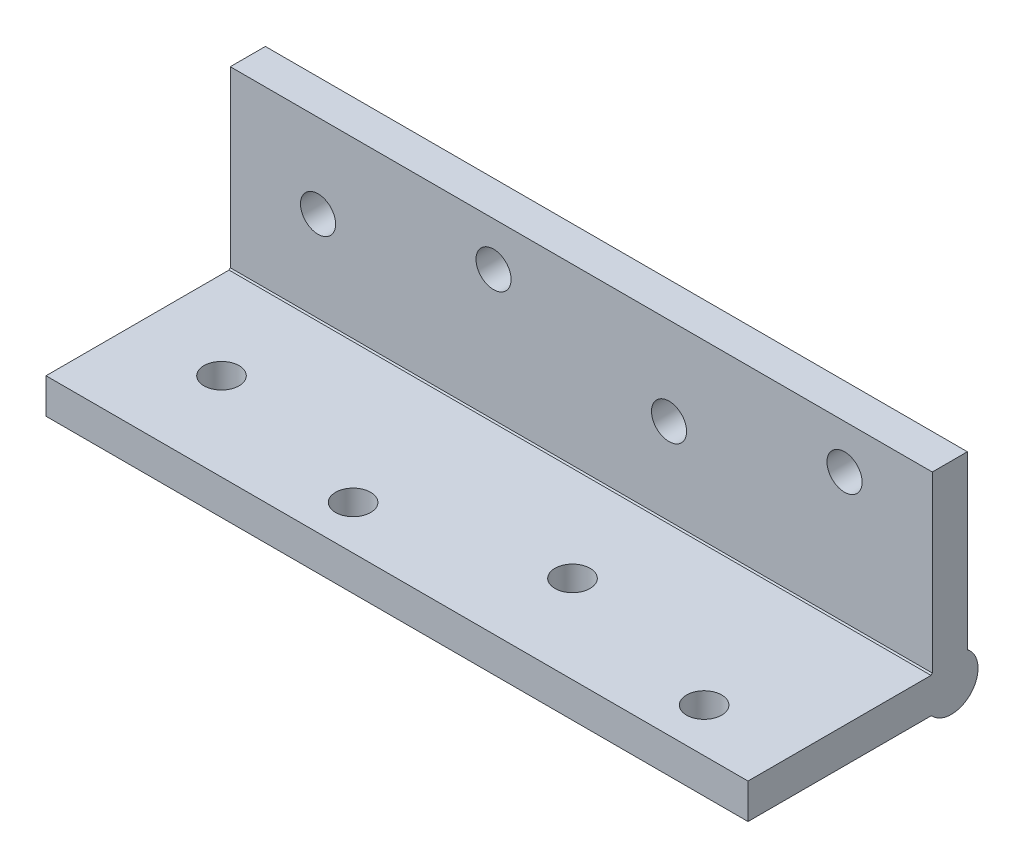
ISO-10303-21;
HEADER;
FILE_DESCRIPTION(('STEP AP214'),'2;1');
FILE_NAME('part.step','',(''),(''),'','','');
FILE_SCHEMA(('AUTOMOTIVE_DESIGN { 1 0 10303 214 1 1 1 1 }'));
ENDSEC;
DATA;
#1=APPLICATION_CONTEXT('core data for automotive mechanical design processes');
#2=APPLICATION_PROTOCOL_DEFINITION('international standard','automotive_design',2000,#1);
#3=PRODUCT_CONTEXT('',#1,'mechanical');
#4=PRODUCT('Part','Part','',(#3));
#5=PRODUCT_RELATED_PRODUCT_CATEGORY('part','',(#4));
#6=PRODUCT_DEFINITION_FORMATION('','',#4);
#7=PRODUCT_DEFINITION_CONTEXT('part definition',#1,'design');
#8=PRODUCT_DEFINITION('design','',#6,#7);
#9=PRODUCT_DEFINITION_SHAPE('','',#8);
#10=(LENGTH_UNIT() NAMED_UNIT(*) SI_UNIT(.MILLI.,.METRE.));
#11=(NAMED_UNIT(*) PLANE_ANGLE_UNIT() SI_UNIT($,.RADIAN.));
#12=(NAMED_UNIT(*) SI_UNIT($,.STERADIAN.) SOLID_ANGLE_UNIT());
#13=UNCERTAINTY_MEASURE_WITH_UNIT(LENGTH_MEASURE(1.E-05),#10,'distance_accuracy_value','');
#14=(GEOMETRIC_REPRESENTATION_CONTEXT(3) GLOBAL_UNCERTAINTY_ASSIGNED_CONTEXT((#13)) GLOBAL_UNIT_ASSIGNED_CONTEXT((#10,
#11,#12)) REPRESENTATION_CONTEXT('',''));
#15=CARTESIAN_POINT('',(0.,0.,0.));
#16=DIRECTION('',(0.,0.,1.));
#17=DIRECTION('',(1.,0.,0.));
#18=AXIS2_PLACEMENT_3D('',#15,#16,#17);
#19=CARTESIAN_POINT('',(40.,4.,-12.5));
#20=DIRECTION('',(-1.,0.,0.));
#21=DIRECTION('',(0.,0.,1.));
#22=AXIS2_PLACEMENT_3D('',#19,#20,#21);
#23=PLANE('',#22);
#24=DIRECTION('',(0.,0.,-1.));
#25=VECTOR('',#24,1.);
#26=CARTESIAN_POINT('',(40.,0.,-12.5));
#27=LINE('',#26,#25);
#28=CARTESIAN_POINT('',(40.,0.,12.5));
#29=VERTEX_POINT('',#28);
#30=CARTESIAN_POINT('',(40.,0.,-8.40517207912375));
#31=VERTEX_POINT('',#30);
#32=EDGE_CURVE('E184',#29,#31,#27,.T.);
#33=ORIENTED_EDGE('',*,*,#32,.T.);
#34=CARTESIAN_POINT('',(40.,2.02819838325771,-10.673404756013));
#35=DIRECTION('',(-1.,0.,0.));
#36=DIRECTION('',(0.,0.,1.));
#37=AXIS2_PLACEMENT_3D('',#34,#35,#36);
#38=CIRCLE('',#37,3.04277310333144);
#39=CARTESIAN_POINT('',(40.,4.46171805094096,-12.5));
#40=VERTEX_POINT('',#39);
#41=EDGE_CURVE('E185',#40,#31,#38,.T.);
#42=ORIENTED_EDGE('',*,*,#41,.F.);
#43=DIRECTION('',(0.,-1.,0.));
#44=VECTOR('',#43,1.);
#45=CARTESIAN_POINT('',(40.,4.,-12.5));
#46=LINE('',#45,#44);
#47=CARTESIAN_POINT('',(40.,24.,-12.5));
#48=VERTEX_POINT('',#47);
#49=EDGE_CURVE('E48',#48,#40,#46,.T.);
#50=ORIENTED_EDGE('',*,*,#49,.F.);
#51=DIRECTION('',(0.,0.,-1.));
#52=VECTOR('',#51,1.);
#53=CARTESIAN_POINT('',(40.,24.,-12.5));
#54=LINE('',#53,#52);
#55=CARTESIAN_POINT('',(40.,24.,-8.5));
#56=VERTEX_POINT('',#55);
#57=EDGE_CURVE('E219',#56,#48,#54,.T.);
#58=ORIENTED_EDGE('',*,*,#57,.F.);
#59=DIRECTION('',(0.,-1.,0.));
#60=VECTOR('',#59,1.);
#61=CARTESIAN_POINT('',(40.,24.,-8.5));
#62=LINE('',#61,#60);
#63=CARTESIAN_POINT('',(40.,4.15770065489244,-8.5));
#64=VERTEX_POINT('',#63);
#65=EDGE_CURVE('E197',#56,#64,#62,.T.);
#66=ORIENTED_EDGE('',*,*,#65,.T.);
#67=CARTESIAN_POINT('',(40.,4.,-8.35597804895841));
#68=VERTEX_POINT('',#67);
#69=EDGE_CURVE('E231',#68,#64,#38,.T.);
#70=ORIENTED_EDGE('',*,*,#69,.F.);
#71=DIRECTION('',(0.,0.,-1.));
#72=VECTOR('',#71,1.);
#73=CARTESIAN_POINT('',(40.,4.,-12.5));
#74=LINE('',#73,#72);
#75=CARTESIAN_POINT('',(40.,4.,12.5));
#76=VERTEX_POINT('',#75);
#77=EDGE_CURVE('E56',#76,#68,#74,.T.);
#78=ORIENTED_EDGE('',*,*,#77,.F.);
#79=DIRECTION('',(0.,-1.,0.));
#80=VECTOR('',#79,1.);
#81=CARTESIAN_POINT('',(40.,4.,12.5));
#82=LINE('',#81,#80);
#83=EDGE_CURVE('E135',#76,#29,#82,.T.);
#84=ORIENTED_EDGE('',*,*,#83,.T.);
#85=EDGE_LOOP('',(#33,#42,#50,#58,#66,#70,#78,#84));
#86=FACE_BOUND('',#85,.T.);
#87=ADVANCED_FACE('F39',(#86),#23,.F.);
#88=CARTESIAN_POINT('',(-40.,4.,-12.5));
#89=DIRECTION('',(0.,0.,1.));
#90=DIRECTION('',(1.,0.,0.));
#91=AXIS2_PLACEMENT_3D('',#88,#89,#90);
#92=PLANE('',#91);
#93=CARTESIAN_POINT('',(-30.,14.461718050941,-12.5));
#94=DIRECTION('',(0.,0.,-1.));
#95=DIRECTION('',(-1.,0.,0.));
#96=AXIS2_PLACEMENT_3D('',#93,#94,#95);
#97=CIRCLE('',#96,2.);
#98=CARTESIAN_POINT('',(-32.,14.461718050941,-12.5));
#99=VERTEX_POINT('',#98);
#100=EDGE_CURVE('E144',#99,#99,#97,.T.);
#101=ORIENTED_EDGE('',*,*,#100,.F.);
#102=EDGE_LOOP('',(#101));
#103=FACE_BOUND('',#102,.T.);
#104=CARTESIAN_POINT('',(10.,14.,-12.5));
#105=DIRECTION('',(0.,0.,-1.));
#106=DIRECTION('',(-1.,0.,0.));
#107=AXIS2_PLACEMENT_3D('',#104,#105,#106);
#108=CIRCLE('',#107,2.);
#109=CARTESIAN_POINT('',(8.,14.,-12.5));
#110=VERTEX_POINT('',#109);
#111=EDGE_CURVE('E247',#110,#110,#108,.T.);
#112=ORIENTED_EDGE('',*,*,#111,.F.);
#113=EDGE_LOOP('',(#112));
#114=FACE_BOUND('',#113,.T.);
#115=CARTESIAN_POINT('',(-10.,19.,-12.5));
#116=DIRECTION('',(0.,0.,-1.));
#117=DIRECTION('',(-1.,0.,0.));
#118=AXIS2_PLACEMENT_3D('',#115,#116,#117);
#119=CIRCLE('',#118,2.);
#120=CARTESIAN_POINT('',(-12.,19.,-12.5));
#121=VERTEX_POINT('',#120);
#122=EDGE_CURVE('E242',#121,#121,#119,.T.);
#123=ORIENTED_EDGE('',*,*,#122,.F.);
#124=EDGE_LOOP('',(#123));
#125=FACE_BOUND('',#124,.T.);
#126=CARTESIAN_POINT('',(30.,19.,-12.5));
#127=DIRECTION('',(0.,0.,-1.));
#128=DIRECTION('',(-1.,0.,0.));
#129=AXIS2_PLACEMENT_3D('',#126,#127,#128);
#130=CIRCLE('',#129,2.);
#131=CARTESIAN_POINT('',(28.,19.,-12.5));
#132=VERTEX_POINT('',#131);
#133=EDGE_CURVE('E238',#132,#132,#130,.T.);
#134=ORIENTED_EDGE('',*,*,#133,.F.);
#135=EDGE_LOOP('',(#134));
#136=FACE_BOUND('',#135,.T.);
#137=ORIENTED_EDGE('',*,*,#49,.T.);
#138=DIRECTION('',(-1.,0.,0.));
#139=VECTOR('',#138,1.);
#140=CARTESIAN_POINT('',(40.,4.46171805094096,-12.5));
#141=LINE('',#140,#139);
#142=CARTESIAN_POINT('',(-40.,4.46171805094096,-12.5));
#143=VERTEX_POINT('',#142);
#144=EDGE_CURVE('E105',#40,#143,#141,.T.);
#145=ORIENTED_EDGE('',*,*,#144,.T.);
#146=DIRECTION('',(0.,-1.,0.));
#147=VECTOR('',#146,1.);
#148=CARTESIAN_POINT('',(-40.,4.,-12.5));
#149=LINE('',#148,#147);
#150=CARTESIAN_POINT('',(-40.,24.,-12.5));
#151=VERTEX_POINT('',#150);
#152=EDGE_CURVE('E119',#151,#143,#149,.T.);
#153=ORIENTED_EDGE('',*,*,#152,.F.);
#154=DIRECTION('',(-1.,0.,0.));
#155=VECTOR('',#154,1.);
#156=CARTESIAN_POINT('',(-40.,24.,-12.5));
#157=LINE('',#156,#155);
#158=EDGE_CURVE('E216',#48,#151,#157,.T.);
#159=ORIENTED_EDGE('',*,*,#158,.F.);
#160=EDGE_LOOP('',(#137,#145,#153,#159));
#161=FACE_BOUND('',#160,.T.);
#162=ADVANCED_FACE('F117',(#103,#114,#125,#136,#161),#92,.F.);
#163=CARTESIAN_POINT('',(-40.,4.,-12.5));
#164=DIRECTION('',(1.,0.,0.));
#165=DIRECTION('',(0.,0.,-1.));
#166=AXIS2_PLACEMENT_3D('',#163,#164,#165);
#167=PLANE('',#166);
#168=DIRECTION('',(0.,0.,1.));
#169=VECTOR('',#168,1.);
#170=CARTESIAN_POINT('',(-40.,4.,-12.5));
#171=LINE('',#170,#169);
#172=CARTESIAN_POINT('',(-40.,4.,-8.35597804895841));
#173=VERTEX_POINT('',#172);
#174=CARTESIAN_POINT('',(-40.,4.,12.5));
#175=VERTEX_POINT('',#174);
#176=EDGE_CURVE('E206',#173,#175,#171,.T.);
#177=ORIENTED_EDGE('',*,*,#176,.F.);
#178=CARTESIAN_POINT('',(-40.,2.02819838325771,-10.673404756013));
#179=DIRECTION('',(-1.,0.,0.));
#180=DIRECTION('',(0.,0.,1.));
#181=AXIS2_PLACEMENT_3D('',#178,#179,#180);
#182=CIRCLE('',#181,3.04277310333144);
#183=CARTESIAN_POINT('',(-40.,4.15770065489244,-8.5));
#184=VERTEX_POINT('',#183);
#185=EDGE_CURVE('E113',#173,#184,#182,.T.);
#186=ORIENTED_EDGE('',*,*,#185,.T.);
#187=DIRECTION('',(0.,-1.,0.));
#188=VECTOR('',#187,1.);
#189=CARTESIAN_POINT('',(-40.,24.,-8.5));
#190=LINE('',#189,#188);
#191=CARTESIAN_POINT('',(-40.,24.,-8.5));
#192=VERTEX_POINT('',#191);
#193=EDGE_CURVE('E191',#192,#184,#190,.T.);
#194=ORIENTED_EDGE('',*,*,#193,.F.);
#195=DIRECTION('',(0.,0.,1.));
#196=VECTOR('',#195,1.);
#197=CARTESIAN_POINT('',(-40.,24.,-12.5));
#198=LINE('',#197,#196);
#199=EDGE_CURVE('E122',#151,#192,#198,.T.);
#200=ORIENTED_EDGE('',*,*,#199,.F.);
#201=ORIENTED_EDGE('',*,*,#152,.T.);
#202=CARTESIAN_POINT('',(-40.,0.,-8.40517207912375));
#203=VERTEX_POINT('',#202);
#204=EDGE_CURVE('E102',#143,#203,#182,.T.);
#205=ORIENTED_EDGE('',*,*,#204,.T.);
#206=DIRECTION('',(0.,0.,1.));
#207=VECTOR('',#206,1.);
#208=CARTESIAN_POINT('',(-40.,0.,-12.5));
#209=LINE('',#208,#207);
#210=CARTESIAN_POINT('',(-40.,0.,12.5));
#211=VERTEX_POINT('',#210);
#212=EDGE_CURVE('E190',#203,#211,#209,.T.);
#213=ORIENTED_EDGE('',*,*,#212,.T.);
#214=DIRECTION('',(0.,-1.,0.));
#215=VECTOR('',#214,1.);
#216=CARTESIAN_POINT('',(-40.,4.,12.5));
#217=LINE('',#216,#215);
#218=EDGE_CURVE('E129',#175,#211,#217,.T.);
#219=ORIENTED_EDGE('',*,*,#218,.F.);
#220=EDGE_LOOP('',(#177,#186,#194,#200,#201,#205,#213,#219));
#221=FACE_BOUND('',#220,.T.);
#222=ADVANCED_FACE('F125',(#221),#167,.F.);
#223=CARTESIAN_POINT('',(-40.,4.,12.5));
#224=DIRECTION('',(0.,0.,-1.));
#225=DIRECTION('',(-1.,0.,0.));
#226=AXIS2_PLACEMENT_3D('',#223,#224,#225);
#227=PLANE('',#226);
#228=DIRECTION('',(1.,0.,0.));
#229=VECTOR('',#228,1.);
#230=CARTESIAN_POINT('',(-40.,0.,12.5));
#231=LINE('',#230,#229);
#232=EDGE_CURVE('E195',#211,#29,#231,.T.);
#233=ORIENTED_EDGE('',*,*,#232,.T.);
#234=ORIENTED_EDGE('',*,*,#83,.F.);
#235=DIRECTION('',(1.,0.,0.));
#236=VECTOR('',#235,1.);
#237=CARTESIAN_POINT('',(-40.,4.,12.5));
#238=LINE('',#237,#236);
#239=EDGE_CURVE('E200',#175,#76,#238,.T.);
#240=ORIENTED_EDGE('',*,*,#239,.F.);
#241=ORIENTED_EDGE('',*,*,#218,.T.);
#242=EDGE_LOOP('',(#233,#234,#240,#241));
#243=FACE_BOUND('',#242,.T.);
#244=ADVANCED_FACE('F298',(#243),#227,.F.);
#245=CARTESIAN_POINT('',(0.,4.,0.));
#246=DIRECTION('',(0.,1.,0.));
#247=DIRECTION('',(0.,0.,1.));
#248=AXIS2_PLACEMENT_3D('',#245,#246,#247);
#249=PLANE('',#248);
#250=CARTESIAN_POINT('',(-30.,4.,2.5));
#251=DIRECTION('',(0.,1.,0.));
#252=DIRECTION('',(0.,0.,1.));
#253=AXIS2_PLACEMENT_3D('',#250,#251,#252);
#254=CIRCLE('',#253,2.);
#255=CARTESIAN_POINT('',(-30.,4.,4.5));
#256=VERTEX_POINT('',#255);
#257=EDGE_CURVE('E243',#256,#256,#254,.T.);
#258=ORIENTED_EDGE('',*,*,#257,.F.);
#259=EDGE_LOOP('',(#258));
#260=FACE_BOUND('',#259,.T.);
#261=CARTESIAN_POINT('',(-10.,4.,7.5));
#262=DIRECTION('',(0.,1.,0.));
#263=DIRECTION('',(0.,0.,1.));
#264=AXIS2_PLACEMENT_3D('',#261,#262,#263);
#265=CIRCLE('',#264,2.);
#266=CARTESIAN_POINT('',(-10.,4.,9.5));
#267=VERTEX_POINT('',#266);
#268=EDGE_CURVE('E256',#267,#267,#265,.T.);
#269=ORIENTED_EDGE('',*,*,#268,.F.);
#270=EDGE_LOOP('',(#269));
#271=FACE_BOUND('',#270,.T.);
#272=CARTESIAN_POINT('',(10.,4.,2.5));
#273=DIRECTION('',(0.,1.,0.));
#274=DIRECTION('',(0.,0.,1.));
#275=AXIS2_PLACEMENT_3D('',#272,#273,#274);
#276=CIRCLE('',#275,2.);
#277=CARTESIAN_POINT('',(10.,4.,4.5));
#278=VERTEX_POINT('',#277);
#279=EDGE_CURVE('E260',#278,#278,#276,.T.);
#280=ORIENTED_EDGE('',*,*,#279,.F.);
#281=EDGE_LOOP('',(#280));
#282=FACE_BOUND('',#281,.T.);
#283=CARTESIAN_POINT('',(30.,4.,7.5));
#284=DIRECTION('',(0.,1.,0.));
#285=DIRECTION('',(0.,0.,1.));
#286=AXIS2_PLACEMENT_3D('',#283,#284,#285);
#287=CIRCLE('',#286,2.);
#288=CARTESIAN_POINT('',(30.,4.,9.5));
#289=VERTEX_POINT('',#288);
#290=EDGE_CURVE('E264',#289,#289,#287,.T.);
#291=ORIENTED_EDGE('',*,*,#290,.F.);
#292=EDGE_LOOP('',(#291));
#293=FACE_BOUND('',#292,.T.);
#294=DIRECTION('',(-1.,0.,0.));
#295=VECTOR('',#294,1.);
#296=CARTESIAN_POINT('',(40.,4.,-8.35597804895841));
#297=LINE('',#296,#295);
#298=EDGE_CURVE('E60',#173,#68,#297,.F.);
#299=ORIENTED_EDGE('',*,*,#298,.F.);
#300=ORIENTED_EDGE('',*,*,#176,.T.);
#301=ORIENTED_EDGE('',*,*,#239,.T.);
#302=ORIENTED_EDGE('',*,*,#77,.T.);
#303=EDGE_LOOP('',(#299,#300,#301,#302));
#304=FACE_BOUND('',#303,.T.);
#305=ADVANCED_FACE('F290',(#260,#271,#282,#293,#304),#249,.T.);
#306=CARTESIAN_POINT('',(0.,0.,0.));
#307=DIRECTION('',(0.,1.,0.));
#308=DIRECTION('',(0.,0.,1.));
#309=AXIS2_PLACEMENT_3D('',#306,#307,#308);
#310=PLANE('',#309);
#311=CARTESIAN_POINT('',(-30.,0.,2.5));
#312=DIRECTION('',(0.,-1.,0.));
#313=DIRECTION('',(0.,0.,-1.));
#314=AXIS2_PLACEMENT_3D('',#311,#312,#313);
#315=CIRCLE('',#314,2.);
#316=CARTESIAN_POINT('',(-30.,0.,0.499999999999994));
#317=VERTEX_POINT('',#316);
#318=EDGE_CURVE('E268',#317,#317,#315,.T.);
#319=ORIENTED_EDGE('',*,*,#318,.F.);
#320=EDGE_LOOP('',(#319));
#321=FACE_BOUND('',#320,.T.);
#322=CARTESIAN_POINT('',(-10.,0.,7.5));
#323=DIRECTION('',(0.,-1.,0.));
#324=DIRECTION('',(0.,0.,-1.));
#325=AXIS2_PLACEMENT_3D('',#322,#323,#324);
#326=CIRCLE('',#325,2.);
#327=CARTESIAN_POINT('',(-10.,0.,5.5));
#328=VERTEX_POINT('',#327);
#329=EDGE_CURVE('E277',#328,#328,#326,.T.);
#330=ORIENTED_EDGE('',*,*,#329,.F.);
#331=EDGE_LOOP('',(#330));
#332=FACE_BOUND('',#331,.T.);
#333=CARTESIAN_POINT('',(10.,0.,2.5));
#334=DIRECTION('',(0.,-1.,0.));
#335=DIRECTION('',(0.,0.,-1.));
#336=AXIS2_PLACEMENT_3D('',#333,#334,#335);
#337=CIRCLE('',#336,2.);
#338=CARTESIAN_POINT('',(10.,0.,0.499999999999997));
#339=VERTEX_POINT('',#338);
#340=EDGE_CURVE('E273',#339,#339,#337,.T.);
#341=ORIENTED_EDGE('',*,*,#340,.F.);
#342=EDGE_LOOP('',(#341));
#343=FACE_BOUND('',#342,.T.);
#344=CARTESIAN_POINT('',(30.,0.,7.5));
#345=DIRECTION('',(0.,-1.,0.));
#346=DIRECTION('',(0.,0.,-1.));
#347=AXIS2_PLACEMENT_3D('',#344,#345,#346);
#348=CIRCLE('',#347,2.);
#349=CARTESIAN_POINT('',(30.,0.,5.49999999999999));
#350=VERTEX_POINT('',#349);
#351=EDGE_CURVE('E269',#350,#350,#348,.T.);
#352=ORIENTED_EDGE('',*,*,#351,.F.);
#353=EDGE_LOOP('',(#352));
#354=FACE_BOUND('',#353,.T.);
#355=ORIENTED_EDGE('',*,*,#212,.F.);
#356=DIRECTION('',(-1.,0.,0.));
#357=VECTOR('',#356,1.);
#358=CARTESIAN_POINT('',(40.,0.,-8.40517207912375));
#359=LINE('',#358,#357);
#360=EDGE_CURVE('E108',#203,#31,#359,.F.);
#361=ORIENTED_EDGE('',*,*,#360,.T.);
#362=ORIENTED_EDGE('',*,*,#32,.F.);
#363=ORIENTED_EDGE('',*,*,#232,.F.);
#364=EDGE_LOOP('',(#355,#361,#362,#363));
#365=FACE_BOUND('',#364,.T.);
#366=ADVANCED_FACE('F287',(#321,#332,#343,#354,#365),#310,.F.);
#367=CARTESIAN_POINT('',(-40.,24.,-8.5));
#368=DIRECTION('',(0.,0.,-1.));
#369=DIRECTION('',(-1.,0.,0.));
#370=AXIS2_PLACEMENT_3D('',#367,#368,#369);
#371=PLANE('',#370);
#372=CARTESIAN_POINT('',(-30.,14.461718050941,-8.50000000000001));
#373=DIRECTION('',(0.,0.,-1.));
#374=DIRECTION('',(-1.,0.,0.));
#375=AXIS2_PLACEMENT_3D('',#372,#373,#374);
#376=CIRCLE('',#375,2.);
#377=CARTESIAN_POINT('',(-32.,14.461718050941,-8.50000000000001));
#378=VERTEX_POINT('',#377);
#379=EDGE_CURVE('E42',#378,#378,#376,.T.);
#380=ORIENTED_EDGE('',*,*,#379,.T.);
#381=EDGE_LOOP('',(#380));
#382=FACE_BOUND('',#381,.T.);
#383=CARTESIAN_POINT('',(10.,14.,-8.50000000000001));
#384=DIRECTION('',(0.,0.,-1.));
#385=DIRECTION('',(-1.,0.,0.));
#386=AXIS2_PLACEMENT_3D('',#383,#384,#385);
#387=CIRCLE('',#386,2.);
#388=CARTESIAN_POINT('',(8.,14.,-8.50000000000001));
#389=VERTEX_POINT('',#388);
#390=EDGE_CURVE('E147',#389,#389,#387,.T.);
#391=ORIENTED_EDGE('',*,*,#390,.T.);
#392=EDGE_LOOP('',(#391));
#393=FACE_BOUND('',#392,.T.);
#394=CARTESIAN_POINT('',(-10.,19.,-8.50000000000001));
#395=DIRECTION('',(0.,0.,-1.));
#396=DIRECTION('',(-1.,0.,0.));
#397=AXIS2_PLACEMENT_3D('',#394,#395,#396);
#398=CIRCLE('',#397,2.);
#399=CARTESIAN_POINT('',(-12.,19.,-8.50000000000001));
#400=VERTEX_POINT('',#399);
#401=EDGE_CURVE('E143',#400,#400,#398,.T.);
#402=ORIENTED_EDGE('',*,*,#401,.T.);
#403=EDGE_LOOP('',(#402));
#404=FACE_BOUND('',#403,.T.);
#405=CARTESIAN_POINT('',(30.,19.,-8.50000000000001));
#406=DIRECTION('',(0.,0.,-1.));
#407=DIRECTION('',(-1.,0.,0.));
#408=AXIS2_PLACEMENT_3D('',#405,#406,#407);
#409=CIRCLE('',#408,2.);
#410=CARTESIAN_POINT('',(28.,19.,-8.50000000000001));
#411=VERTEX_POINT('',#410);
#412=EDGE_CURVE('E139',#411,#411,#409,.T.);
#413=ORIENTED_EDGE('',*,*,#412,.T.);
#414=EDGE_LOOP('',(#413));
#415=FACE_BOUND('',#414,.T.);
#416=ORIENTED_EDGE('',*,*,#193,.T.);
#417=DIRECTION('',(-1.,0.,0.));
#418=VECTOR('',#417,1.);
#419=CARTESIAN_POINT('',(40.,4.15770065489244,-8.5));
#420=LINE('',#419,#418);
#421=EDGE_CURVE('E11',#184,#64,#420,.F.);
#422=ORIENTED_EDGE('',*,*,#421,.T.);
#423=ORIENTED_EDGE('',*,*,#65,.F.);
#424=DIRECTION('',(1.,0.,0.));
#425=VECTOR('',#424,1.);
#426=CARTESIAN_POINT('',(-40.,24.,-8.5));
#427=LINE('',#426,#425);
#428=EDGE_CURVE('E223',#192,#56,#427,.T.);
#429=ORIENTED_EDGE('',*,*,#428,.F.);
#430=EDGE_LOOP('',(#416,#422,#423,#429));
#431=FACE_BOUND('',#430,.T.);
#432=ADVANCED_FACE('F156',(#382,#393,#404,#415,#431),#371,.F.);
#433=CARTESIAN_POINT('',(0.,24.,0.));
#434=DIRECTION('',(0.,1.,0.));
#435=DIRECTION('',(0.,0.,1.));
#436=AXIS2_PLACEMENT_3D('',#433,#434,#435);
#437=PLANE('',#436);
#438=ORIENTED_EDGE('',*,*,#199,.T.);
#439=ORIENTED_EDGE('',*,*,#428,.T.);
#440=ORIENTED_EDGE('',*,*,#57,.T.);
#441=ORIENTED_EDGE('',*,*,#158,.T.);
#442=EDGE_LOOP('',(#438,#439,#440,#441));
#443=FACE_BOUND('',#442,.T.);
#444=ADVANCED_FACE('F308',(#443),#437,.T.);
#445=CARTESIAN_POINT('',(40.,2.02819838325771,-10.673404756013));
#446=DIRECTION('',(-1.,0.,0.));
#447=DIRECTION('',(0.,0.,1.));
#448=AXIS2_PLACEMENT_3D('',#445,#446,#447);
#449=CYLINDRICAL_SURFACE('',#448,3.04277310333144);
#450=ORIENTED_EDGE('',*,*,#185,.F.);
#451=ORIENTED_EDGE('',*,*,#298,.T.);
#452=ORIENTED_EDGE('',*,*,#69,.T.);
#453=ORIENTED_EDGE('',*,*,#421,.F.);
#454=EDGE_LOOP('',(#450,#451,#452,#453));
#455=FACE_BOUND('',#454,.T.);
#456=ADVANCED_FACE('F305',(#455),#449,.T.);
#457=ORIENTED_EDGE('',*,*,#144,.F.);
#458=ORIENTED_EDGE('',*,*,#41,.T.);
#459=ORIENTED_EDGE('',*,*,#360,.F.);
#460=ORIENTED_EDGE('',*,*,#204,.F.);
#461=EDGE_LOOP('',(#457,#458,#459,#460));
#462=FACE_BOUND('',#461,.T.);
#463=ADVANCED_FACE('F104',(#462),#449,.T.);
#464=CARTESIAN_POINT('',(30.,19.,67.5));
#465=DIRECTION('',(0.,0.,-1.));
#466=DIRECTION('',(-1.,0.,0.));
#467=AXIS2_PLACEMENT_3D('',#464,#465,#466);
#468=CYLINDRICAL_SURFACE('',#467,2.);
#469=ORIENTED_EDGE('',*,*,#133,.T.);
#470=EDGE_LOOP('',(#469));
#471=FACE_BOUND('',#470,.T.);
#472=ORIENTED_EDGE('',*,*,#412,.F.);
#473=EDGE_LOOP('',(#472));
#474=FACE_BOUND('',#473,.T.);
#475=ADVANCED_FACE('F357',(#471,#474),#468,.F.);
#476=CARTESIAN_POINT('',(-10.,19.,67.5));
#477=DIRECTION('',(0.,0.,-1.));
#478=DIRECTION('',(-1.,0.,0.));
#479=AXIS2_PLACEMENT_3D('',#476,#477,#478);
#480=CYLINDRICAL_SURFACE('',#479,2.);
#481=ORIENTED_EDGE('',*,*,#122,.T.);
#482=EDGE_LOOP('',(#481));
#483=FACE_BOUND('',#482,.T.);
#484=ORIENTED_EDGE('',*,*,#401,.F.);
#485=EDGE_LOOP('',(#484));
#486=FACE_BOUND('',#485,.T.);
#487=ADVANCED_FACE('F171',(#483,#486),#480,.F.);
#488=CARTESIAN_POINT('',(10.,14.,67.5));
#489=DIRECTION('',(0.,0.,-1.));
#490=DIRECTION('',(-1.,0.,0.));
#491=AXIS2_PLACEMENT_3D('',#488,#489,#490);
#492=CYLINDRICAL_SURFACE('',#491,2.);
#493=ORIENTED_EDGE('',*,*,#111,.T.);
#494=EDGE_LOOP('',(#493));
#495=FACE_BOUND('',#494,.T.);
#496=ORIENTED_EDGE('',*,*,#390,.F.);
#497=EDGE_LOOP('',(#496));
#498=FACE_BOUND('',#497,.T.);
#499=ADVANCED_FACE('F161',(#495,#498),#492,.F.);
#500=CARTESIAN_POINT('',(-30.,14.461718050941,67.5));
#501=DIRECTION('',(0.,0.,-1.));
#502=DIRECTION('',(-1.,0.,0.));
#503=AXIS2_PLACEMENT_3D('',#500,#501,#502);
#504=CYLINDRICAL_SURFACE('',#503,2.);
#505=ORIENTED_EDGE('',*,*,#100,.T.);
#506=EDGE_LOOP('',(#505));
#507=FACE_BOUND('',#506,.T.);
#508=ORIENTED_EDGE('',*,*,#379,.F.);
#509=EDGE_LOOP('',(#508));
#510=FACE_BOUND('',#509,.T.);
#511=ADVANCED_FACE('F158',(#507,#510),#504,.F.);
#512=CARTESIAN_POINT('',(30.,80.,7.5));
#513=DIRECTION('',(0.,-1.,0.));
#514=DIRECTION('',(0.,0.,-1.));
#515=AXIS2_PLACEMENT_3D('',#512,#513,#514);
#516=CYLINDRICAL_SURFACE('',#515,2.);
#517=ORIENTED_EDGE('',*,*,#290,.T.);
#518=EDGE_LOOP('',(#517));
#519=FACE_BOUND('',#518,.T.);
#520=ORIENTED_EDGE('',*,*,#351,.T.);
#521=EDGE_LOOP('',(#520));
#522=FACE_BOUND('',#521,.T.);
#523=ADVANCED_FACE('F160',(#519,#522),#516,.F.);
#524=CARTESIAN_POINT('',(10.,80.,2.5));
#525=DIRECTION('',(0.,-1.,0.));
#526=DIRECTION('',(0.,0.,-1.));
#527=AXIS2_PLACEMENT_3D('',#524,#525,#526);
#528=CYLINDRICAL_SURFACE('',#527,2.);
#529=ORIENTED_EDGE('',*,*,#279,.T.);
#530=EDGE_LOOP('',(#529));
#531=FACE_BOUND('',#530,.T.);
#532=ORIENTED_EDGE('',*,*,#340,.T.);
#533=EDGE_LOOP('',(#532));
#534=FACE_BOUND('',#533,.T.);
#535=ADVANCED_FACE('F168',(#531,#534),#528,.F.);
#536=CARTESIAN_POINT('',(-10.,80.,7.5));
#537=DIRECTION('',(0.,-1.,0.));
#538=DIRECTION('',(0.,0.,-1.));
#539=AXIS2_PLACEMENT_3D('',#536,#537,#538);
#540=CYLINDRICAL_SURFACE('',#539,2.);
#541=ORIENTED_EDGE('',*,*,#268,.T.);
#542=EDGE_LOOP('',(#541));
#543=FACE_BOUND('',#542,.T.);
#544=ORIENTED_EDGE('',*,*,#329,.T.);
#545=EDGE_LOOP('',(#544));
#546=FACE_BOUND('',#545,.T.);
#547=ADVANCED_FACE('F396',(#543,#546),#540,.F.);
#548=CARTESIAN_POINT('',(-30.,80.,2.5));
#549=DIRECTION('',(0.,-1.,0.));
#550=DIRECTION('',(0.,0.,-1.));
#551=AXIS2_PLACEMENT_3D('',#548,#549,#550);
#552=CYLINDRICAL_SURFACE('',#551,2.);
#553=ORIENTED_EDGE('',*,*,#257,.T.);
#554=EDGE_LOOP('',(#553));
#555=FACE_BOUND('',#554,.T.);
#556=ORIENTED_EDGE('',*,*,#318,.T.);
#557=EDGE_LOOP('',(#556));
#558=FACE_BOUND('',#557,.T.);
#559=ADVANCED_FACE('F285',(#555,#558),#552,.F.);
#560=CLOSED_SHELL('',(#87,#162,#222,#244,#305,#366,#432,#444,#456,#463,#475,#487,#499,#511,#523,
#535,#547,#559));
#561=MANIFOLD_SOLID_BREP('B2',#560);
#562=ADVANCED_BREP_SHAPE_REPRESENTATION('',(#18,#561),#14);
#563=SHAPE_DEFINITION_REPRESENTATION(#9,#562);
ENDSEC;
END-ISO-10303-21;
